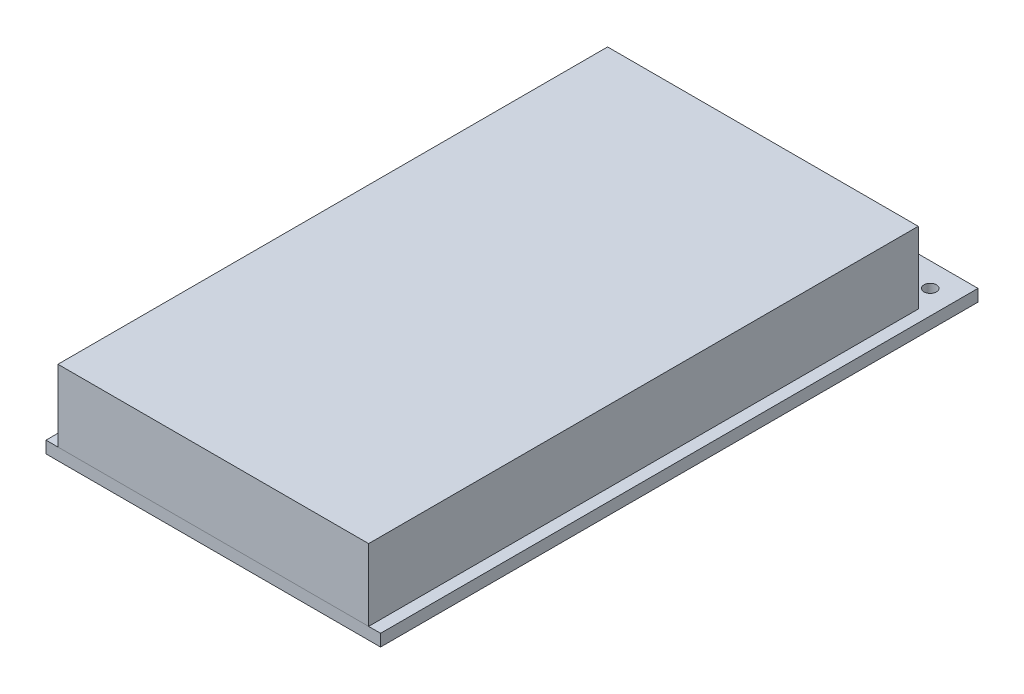
ISO-10303-21;
HEADER;
FILE_DESCRIPTION(('STEP AP214'),'2;1');
FILE_NAME('part.step','',(''),(''),'','','');
FILE_SCHEMA(('AUTOMOTIVE_DESIGN { 1 0 10303 214 1 1 1 1 }'));
ENDSEC;
DATA;
#1=APPLICATION_CONTEXT('core data for automotive mechanical design processes');
#2=APPLICATION_PROTOCOL_DEFINITION('international standard','automotive_design',2000,#1);
#3=PRODUCT_CONTEXT('',#1,'mechanical');
#4=PRODUCT('Part','Part','',(#3));
#5=PRODUCT_RELATED_PRODUCT_CATEGORY('part','',(#4));
#6=PRODUCT_DEFINITION_FORMATION('','',#4);
#7=PRODUCT_DEFINITION_CONTEXT('part definition',#1,'design');
#8=PRODUCT_DEFINITION('design','',#6,#7);
#9=PRODUCT_DEFINITION_SHAPE('','',#8);
#10=(LENGTH_UNIT() NAMED_UNIT(*) SI_UNIT(.MILLI.,.METRE.));
#11=(NAMED_UNIT(*) PLANE_ANGLE_UNIT() SI_UNIT($,.RADIAN.));
#12=(NAMED_UNIT(*) SI_UNIT($,.STERADIAN.) SOLID_ANGLE_UNIT());
#13=UNCERTAINTY_MEASURE_WITH_UNIT(LENGTH_MEASURE(1.E-05),#10,'distance_accuracy_value','');
#14=(GEOMETRIC_REPRESENTATION_CONTEXT(3) GLOBAL_UNCERTAINTY_ASSIGNED_CONTEXT((#13)) GLOBAL_UNIT_ASSIGNED_CONTEXT((#10,
#11,#12)) REPRESENTATION_CONTEXT('',''));
#15=CARTESIAN_POINT('',(0.,0.,0.));
#16=DIRECTION('',(0.,0.,1.));
#17=DIRECTION('',(1.,0.,0.));
#18=AXIS2_PLACEMENT_3D('',#15,#16,#17);
#19=CARTESIAN_POINT('',(-82.55,44.45,158.75));
#20=DIRECTION('',(1.,0.,0.));
#21=DIRECTION('',(0.,0.,-1.));
#22=AXIS2_PLACEMENT_3D('',#19,#20,#21);
#23=PLANE('',#22);
#24=DIRECTION('',(0.,0.,1.));
#25=VECTOR('',#24,1.);
#26=CARTESIAN_POINT('',(-82.55,6.35,158.75));
#27=LINE('',#26,#25);
#28=CARTESIAN_POINT('',(-82.55,6.35,-133.35));
#29=VERTEX_POINT('',#28);
#30=CARTESIAN_POINT('',(-82.55,6.35,158.75));
#31=VERTEX_POINT('',#30);
#32=EDGE_CURVE('E114',#29,#31,#27,.T.);
#33=ORIENTED_EDGE('',*,*,#32,.T.);
#34=DIRECTION('',(0.,-1.,0.));
#35=VECTOR('',#34,1.);
#36=CARTESIAN_POINT('',(-82.55,44.45,158.75));
#37=LINE('',#36,#35);
#38=CARTESIAN_POINT('',(-82.55,44.45,158.75));
#39=VERTEX_POINT('',#38);
#40=EDGE_CURVE('E12',#39,#31,#37,.T.);
#41=ORIENTED_EDGE('',*,*,#40,.F.);
#42=DIRECTION('',(0.,0.,1.));
#43=VECTOR('',#42,1.);
#44=CARTESIAN_POINT('',(-82.55,44.45,158.75));
#45=LINE('',#44,#43);
#46=CARTESIAN_POINT('',(-82.55,44.45,-133.35));
#47=VERTEX_POINT('',#46);
#48=EDGE_CURVE('E102',#47,#39,#45,.T.);
#49=ORIENTED_EDGE('',*,*,#48,.F.);
#50=DIRECTION('',(0.,-1.,0.));
#51=VECTOR('',#50,1.);
#52=CARTESIAN_POINT('',(-82.55,44.45,-133.35));
#53=LINE('',#52,#51);
#54=EDGE_CURVE('E110',#47,#29,#53,.T.);
#55=ORIENTED_EDGE('',*,*,#54,.T.);
#56=EDGE_LOOP('',(#33,#41,#49,#55));
#57=FACE_BOUND('',#56,.T.);
#58=ADVANCED_FACE('F51',(#57),#23,.F.);
#59=CARTESIAN_POINT('',(-82.55,44.45,158.75));
#60=DIRECTION('',(0.,0.,-1.));
#61=DIRECTION('',(-1.,0.,0.));
#62=AXIS2_PLACEMENT_3D('',#59,#60,#61);
#63=PLANE('',#62);
#64=DIRECTION('',(1.,0.,0.));
#65=VECTOR('',#64,1.);
#66=CARTESIAN_POINT('',(-82.55,6.35,158.75));
#67=LINE('',#66,#65);
#68=CARTESIAN_POINT('',(82.55,6.35,158.75));
#69=VERTEX_POINT('',#68);
#70=EDGE_CURVE('E106',#31,#69,#67,.T.);
#71=ORIENTED_EDGE('',*,*,#70,.T.);
#72=DIRECTION('',(0.,-1.,0.));
#73=VECTOR('',#72,1.);
#74=CARTESIAN_POINT('',(82.55,44.45,158.75));
#75=LINE('',#74,#73);
#76=CARTESIAN_POINT('',(82.55,44.45,158.75));
#77=VERTEX_POINT('',#76);
#78=EDGE_CURVE('E59',#77,#69,#75,.T.);
#79=ORIENTED_EDGE('',*,*,#78,.F.);
#80=DIRECTION('',(1.,0.,0.));
#81=VECTOR('',#80,1.);
#82=CARTESIAN_POINT('',(-82.55,44.45,158.75));
#83=LINE('',#82,#81);
#84=EDGE_CURVE('E97',#39,#77,#83,.T.);
#85=ORIENTED_EDGE('',*,*,#84,.F.);
#86=ORIENTED_EDGE('',*,*,#40,.T.);
#87=EDGE_LOOP('',(#71,#79,#85,#86));
#88=FACE_BOUND('',#87,.T.);
#89=ADVANCED_FACE('F105',(#88),#63,.F.);
#90=CARTESIAN_POINT('',(82.55,44.45,158.75));
#91=DIRECTION('',(-1.,0.,0.));
#92=DIRECTION('',(0.,0.,1.));
#93=AXIS2_PLACEMENT_3D('',#90,#91,#92);
#94=PLANE('',#93);
#95=DIRECTION('',(0.,0.,-1.));
#96=VECTOR('',#95,1.);
#97=CARTESIAN_POINT('',(82.55,6.35,158.75));
#98=LINE('',#97,#96);
#99=CARTESIAN_POINT('',(82.55,6.35,-133.35));
#100=VERTEX_POINT('',#99);
#101=EDGE_CURVE('E84',#69,#100,#98,.T.);
#102=ORIENTED_EDGE('',*,*,#101,.T.);
#103=DIRECTION('',(0.,-1.,0.));
#104=VECTOR('',#103,1.);
#105=CARTESIAN_POINT('',(82.55,44.45,-133.35));
#106=LINE('',#105,#104);
#107=CARTESIAN_POINT('',(82.55,44.45,-133.35));
#108=VERTEX_POINT('',#107);
#109=EDGE_CURVE('E107',#108,#100,#106,.T.);
#110=ORIENTED_EDGE('',*,*,#109,.F.);
#111=DIRECTION('',(0.,0.,-1.));
#112=VECTOR('',#111,1.);
#113=CARTESIAN_POINT('',(82.55,44.45,158.75));
#114=LINE('',#113,#112);
#115=EDGE_CURVE('E100',#77,#108,#114,.T.);
#116=ORIENTED_EDGE('',*,*,#115,.F.);
#117=ORIENTED_EDGE('',*,*,#78,.T.);
#118=EDGE_LOOP('',(#102,#110,#116,#117));
#119=FACE_BOUND('',#118,.T.);
#120=ADVANCED_FACE('F108',(#119),#94,.F.);
#121=CARTESIAN_POINT('',(-82.55,44.45,-133.35));
#122=DIRECTION('',(0.,0.,1.));
#123=DIRECTION('',(1.,0.,0.));
#124=AXIS2_PLACEMENT_3D('',#121,#122,#123);
#125=PLANE('',#124);
#126=DIRECTION('',(-1.,0.,0.));
#127=VECTOR('',#126,1.);
#128=CARTESIAN_POINT('',(-82.55,6.35,-133.35));
#129=LINE('',#128,#127);
#130=EDGE_CURVE('E90',#100,#29,#129,.T.);
#131=ORIENTED_EDGE('',*,*,#130,.T.);
#132=ORIENTED_EDGE('',*,*,#54,.F.);
#133=DIRECTION('',(-1.,0.,0.));
#134=VECTOR('',#133,1.);
#135=CARTESIAN_POINT('',(-82.55,44.45,-133.35));
#136=LINE('',#135,#134);
#137=EDGE_CURVE('E67',#108,#47,#136,.T.);
#138=ORIENTED_EDGE('',*,*,#137,.F.);
#139=ORIENTED_EDGE('',*,*,#109,.T.);
#140=EDGE_LOOP('',(#131,#132,#138,#139));
#141=FACE_BOUND('',#140,.T.);
#142=ADVANCED_FACE('F121',(#141),#125,.F.);
#143=CARTESIAN_POINT('',(0.,44.45,0.));
#144=DIRECTION('',(0.,-1.,0.));
#145=DIRECTION('',(0.,0.,-1.));
#146=AXIS2_PLACEMENT_3D('',#143,#144,#145);
#147=PLANE('',#146);
#148=ORIENTED_EDGE('',*,*,#48,.T.);
#149=ORIENTED_EDGE('',*,*,#84,.T.);
#150=ORIENTED_EDGE('',*,*,#115,.T.);
#151=ORIENTED_EDGE('',*,*,#137,.T.);
#152=EDGE_LOOP('',(#148,#149,#150,#151));
#153=FACE_BOUND('',#152,.T.);
#154=ADVANCED_FACE('F98',(#153),#147,.F.);
#155=CARTESIAN_POINT('',(0.,6.35,0.));
#156=DIRECTION('',(0.,-1.,0.));
#157=DIRECTION('',(0.,0.,-1.));
#158=AXIS2_PLACEMENT_3D('',#155,#156,#157);
#159=PLANE('',#158);
#160=ORIENTED_EDGE('',*,*,#32,.F.);
#161=ORIENTED_EDGE('',*,*,#130,.F.);
#162=ORIENTED_EDGE('',*,*,#101,.F.);
#163=ORIENTED_EDGE('',*,*,#70,.F.);
#164=EDGE_LOOP('',(#160,#161,#162,#163));
#165=FACE_BOUND('',#164,.T.);
#166=ADVANCED_FACE('F124',(#165),#159,.T.);
#167=CLOSED_SHELL('',(#58,#89,#120,#142,#154,#166));
#168=MANIFOLD_SOLID_BREP('B2',#167);
#169=CARTESIAN_POINT('',(88.8999999999999,6.35,-158.75));
#170=DIRECTION('',(-1.,0.,0.));
#171=DIRECTION('',(0.,0.,1.));
#172=AXIS2_PLACEMENT_3D('',#169,#170,#171);
#173=PLANE('',#172);
#174=DIRECTION('',(0.,0.,-1.));
#175=VECTOR('',#174,1.);
#176=CARTESIAN_POINT('',(88.8999999999999,0.,-158.75));
#177=LINE('',#176,#175);
#178=CARTESIAN_POINT('',(88.9,0.,158.75));
#179=VERTEX_POINT('',#178);
#180=CARTESIAN_POINT('',(88.8999999999999,0.,-158.75));
#181=VERTEX_POINT('',#180);
#182=EDGE_CURVE('E241',#179,#181,#177,.T.);
#183=ORIENTED_EDGE('',*,*,#182,.T.);
#184=DIRECTION('',(0.,-1.,0.));
#185=VECTOR('',#184,1.);
#186=CARTESIAN_POINT('',(88.8999999999999,6.35,-158.75));
#187=LINE('',#186,#185);
#188=CARTESIAN_POINT('',(88.8999999999999,6.35,-158.75));
#189=VERTEX_POINT('',#188);
#190=EDGE_CURVE('E49',#189,#181,#187,.T.);
#191=ORIENTED_EDGE('',*,*,#190,.F.);
#192=DIRECTION('',(0.,0.,-1.));
#193=VECTOR('',#192,1.);
#194=CARTESIAN_POINT('',(88.8999999999999,6.35,-158.75));
#195=LINE('',#194,#193);
#196=CARTESIAN_POINT('',(88.9,6.35,158.75));
#197=VERTEX_POINT('',#196);
#198=EDGE_CURVE('E228',#197,#189,#195,.T.);
#199=ORIENTED_EDGE('',*,*,#198,.F.);
#200=DIRECTION('',(0.,-1.,0.));
#201=VECTOR('',#200,1.);
#202=CARTESIAN_POINT('',(88.9,6.35,158.75));
#203=LINE('',#202,#201);
#204=EDGE_CURVE('E237',#197,#179,#203,.T.);
#205=ORIENTED_EDGE('',*,*,#204,.T.);
#206=EDGE_LOOP('',(#183,#191,#199,#205));
#207=FACE_BOUND('',#206,.T.);
#208=ADVANCED_FACE('F175',(#207),#173,.F.);
#209=CARTESIAN_POINT('',(-88.9,6.35,-158.75));
#210=DIRECTION('',(0.,0.,1.));
#211=DIRECTION('',(1.,0.,0.));
#212=AXIS2_PLACEMENT_3D('',#209,#210,#211);
#213=PLANE('',#212);
#214=DIRECTION('',(-1.,0.,0.));
#215=VECTOR('',#214,1.);
#216=CARTESIAN_POINT('',(-88.9,0.,-158.75));
#217=LINE('',#216,#215);
#218=CARTESIAN_POINT('',(-88.9,0.,-158.75));
#219=VERTEX_POINT('',#218);
#220=EDGE_CURVE('E232',#181,#219,#217,.T.);
#221=ORIENTED_EDGE('',*,*,#220,.T.);
#222=DIRECTION('',(0.,-1.,0.));
#223=VECTOR('',#222,1.);
#224=CARTESIAN_POINT('',(-88.9,6.35,-158.75));
#225=LINE('',#224,#223);
#226=CARTESIAN_POINT('',(-88.9,6.35,-158.75));
#227=VERTEX_POINT('',#226);
#228=EDGE_CURVE('E184',#227,#219,#225,.T.);
#229=ORIENTED_EDGE('',*,*,#228,.F.);
#230=DIRECTION('',(-1.,0.,0.));
#231=VECTOR('',#230,1.);
#232=CARTESIAN_POINT('',(-88.9,6.35,-158.75));
#233=LINE('',#232,#231);
#234=EDGE_CURVE('E223',#189,#227,#233,.T.);
#235=ORIENTED_EDGE('',*,*,#234,.F.);
#236=ORIENTED_EDGE('',*,*,#190,.T.);
#237=EDGE_LOOP('',(#221,#229,#235,#236));
#238=FACE_BOUND('',#237,.T.);
#239=ADVANCED_FACE('F231',(#238),#213,.F.);
#240=CARTESIAN_POINT('',(-88.9,6.35,-158.75));
#241=DIRECTION('',(1.,0.,0.));
#242=DIRECTION('',(0.,0.,-1.));
#243=AXIS2_PLACEMENT_3D('',#240,#241,#242);
#244=PLANE('',#243);
#245=DIRECTION('',(0.,0.,1.));
#246=VECTOR('',#245,1.);
#247=CARTESIAN_POINT('',(-88.9,0.,-158.75));
#248=LINE('',#247,#246);
#249=CARTESIAN_POINT('',(-88.9,0.,158.75));
#250=VERTEX_POINT('',#249);
#251=EDGE_CURVE('E210',#219,#250,#248,.T.);
#252=ORIENTED_EDGE('',*,*,#251,.T.);
#253=DIRECTION('',(0.,-1.,0.));
#254=VECTOR('',#253,1.);
#255=CARTESIAN_POINT('',(-88.9,6.35,158.75));
#256=LINE('',#255,#254);
#257=CARTESIAN_POINT('',(-88.9,6.35,158.75));
#258=VERTEX_POINT('',#257);
#259=EDGE_CURVE('E233',#258,#250,#256,.T.);
#260=ORIENTED_EDGE('',*,*,#259,.F.);
#261=DIRECTION('',(0.,0.,1.));
#262=VECTOR('',#261,1.);
#263=CARTESIAN_POINT('',(-88.9,6.35,-158.75));
#264=LINE('',#263,#262);
#265=EDGE_CURVE('E226',#227,#258,#264,.T.);
#266=ORIENTED_EDGE('',*,*,#265,.F.);
#267=ORIENTED_EDGE('',*,*,#228,.T.);
#268=EDGE_LOOP('',(#252,#260,#266,#267));
#269=FACE_BOUND('',#268,.T.);
#270=ADVANCED_FACE('F235',(#269),#244,.F.);
#271=CARTESIAN_POINT('',(-88.9,6.35,158.75));
#272=DIRECTION('',(0.,0.,-1.));
#273=DIRECTION('',(-1.,0.,0.));
#274=AXIS2_PLACEMENT_3D('',#271,#272,#273);
#275=PLANE('',#274);
#276=DIRECTION('',(1.,0.,0.));
#277=VECTOR('',#276,1.);
#278=CARTESIAN_POINT('',(-88.9,0.,158.75));
#279=LINE('',#278,#277);
#280=EDGE_CURVE('E216',#250,#179,#279,.T.);
#281=ORIENTED_EDGE('',*,*,#280,.T.);
#282=ORIENTED_EDGE('',*,*,#204,.F.);
#283=DIRECTION('',(1.,0.,0.));
#284=VECTOR('',#283,1.);
#285=CARTESIAN_POINT('',(-88.9,6.35,158.75));
#286=LINE('',#285,#284);
#287=EDGE_CURVE('E193',#258,#197,#286,.T.);
#288=ORIENTED_EDGE('',*,*,#287,.F.);
#289=ORIENTED_EDGE('',*,*,#259,.T.);
#290=EDGE_LOOP('',(#281,#282,#288,#289));
#291=FACE_BOUND('',#290,.T.);
#292=ADVANCED_FACE('F269',(#291),#275,.F.);
#293=CARTESIAN_POINT('',(0.,6.35,0.));
#294=DIRECTION('',(0.,1.,0.));
#295=DIRECTION('',(0.,0.,1.));
#296=AXIS2_PLACEMENT_3D('',#293,#294,#295);
#297=PLANE('',#296);
#298=CARTESIAN_POINT('',(76.2,6.35,-146.05));
#299=DIRECTION('',(0.,1.,0.));
#300=DIRECTION('',(0.,0.,1.));
#301=AXIS2_PLACEMENT_3D('',#298,#299,#300);
#302=CIRCLE('',#301,3.302);
#303=CARTESIAN_POINT('',(76.2,6.35,-142.748));
#304=VERTEX_POINT('',#303);
#305=EDGE_CURVE('E244',#304,#304,#302,.T.);
#306=ORIENTED_EDGE('',*,*,#305,.F.);
#307=EDGE_LOOP('',(#306));
#308=FACE_BOUND('',#307,.T.);
#309=CARTESIAN_POINT('',(-76.1999999999999,6.35,-146.05));
#310=DIRECTION('',(0.,1.,0.));
#311=DIRECTION('',(0.,0.,1.));
#312=AXIS2_PLACEMENT_3D('',#309,#310,#311);
#313=CIRCLE('',#312,3.302);
#314=CARTESIAN_POINT('',(-76.1999999999999,6.35,-142.748));
#315=VERTEX_POINT('',#314);
#316=EDGE_CURVE('E251',#315,#315,#313,.T.);
#317=ORIENTED_EDGE('',*,*,#316,.F.);
#318=EDGE_LOOP('',(#317));
#319=FACE_BOUND('',#318,.T.);
#320=ORIENTED_EDGE('',*,*,#198,.T.);
#321=ORIENTED_EDGE('',*,*,#234,.T.);
#322=ORIENTED_EDGE('',*,*,#265,.T.);
#323=ORIENTED_EDGE('',*,*,#287,.T.);
#324=EDGE_LOOP('',(#320,#321,#322,#323));
#325=FACE_BOUND('',#324,.T.);
#326=ADVANCED_FACE('F224',(#308,#319,#325),#297,.T.);
#327=CARTESIAN_POINT('',(0.,0.,0.));
#328=DIRECTION('',(0.,1.,0.));
#329=DIRECTION('',(0.,0.,1.));
#330=AXIS2_PLACEMENT_3D('',#327,#328,#329);
#331=PLANE('',#330);
#332=CARTESIAN_POINT('',(76.2,0.,-146.05));
#333=DIRECTION('',(0.,1.,0.));
#334=DIRECTION('',(0.,0.,1.));
#335=AXIS2_PLACEMENT_3D('',#332,#333,#334);
#336=CIRCLE('',#335,3.302);
#337=CARTESIAN_POINT('',(76.2,0.,-142.748));
#338=VERTEX_POINT('',#337);
#339=EDGE_CURVE('E178',#338,#338,#336,.T.);
#340=ORIENTED_EDGE('',*,*,#339,.T.);
#341=EDGE_LOOP('',(#340));
#342=FACE_BOUND('',#341,.T.);
#343=CARTESIAN_POINT('',(-76.1999999999999,0.,-146.05));
#344=DIRECTION('',(0.,1.,0.));
#345=DIRECTION('',(0.,0.,1.));
#346=AXIS2_PLACEMENT_3D('',#343,#344,#345);
#347=CIRCLE('',#346,3.302);
#348=CARTESIAN_POINT('',(-76.1999999999999,0.,-142.748));
#349=VERTEX_POINT('',#348);
#350=EDGE_CURVE('E249',#349,#349,#347,.T.);
#351=ORIENTED_EDGE('',*,*,#350,.T.);
#352=EDGE_LOOP('',(#351));
#353=FACE_BOUND('',#352,.T.);
#354=ORIENTED_EDGE('',*,*,#182,.F.);
#355=ORIENTED_EDGE('',*,*,#280,.F.);
#356=ORIENTED_EDGE('',*,*,#251,.F.);
#357=ORIENTED_EDGE('',*,*,#220,.F.);
#358=EDGE_LOOP('',(#354,#355,#356,#357));
#359=FACE_BOUND('',#358,.T.);
#360=ADVANCED_FACE('F268',(#342,#353,#359),#331,.F.);
#361=CARTESIAN_POINT('',(-76.1999999999999,44.45,-146.05));
#362=DIRECTION('',(0.,-1.,0.));
#363=DIRECTION('',(0.,0.,-1.));
#364=AXIS2_PLACEMENT_3D('',#361,#362,#363);
#365=CYLINDRICAL_SURFACE('',#364,3.302);
#366=ORIENTED_EDGE('',*,*,#316,.T.);
#367=EDGE_LOOP('',(#366));
#368=FACE_BOUND('',#367,.T.);
#369=ORIENTED_EDGE('',*,*,#350,.F.);
#370=EDGE_LOOP('',(#369));
#371=FACE_BOUND('',#370,.T.);
#372=ADVANCED_FACE('F275',(#368,#371),#365,.F.);
#373=CARTESIAN_POINT('',(76.2,44.45,-146.05));
#374=DIRECTION('',(0.,-1.,0.));
#375=DIRECTION('',(0.,0.,-1.));
#376=AXIS2_PLACEMENT_3D('',#373,#374,#375);
#377=CYLINDRICAL_SURFACE('',#376,3.302);
#378=ORIENTED_EDGE('',*,*,#305,.T.);
#379=EDGE_LOOP('',(#378));
#380=FACE_BOUND('',#379,.T.);
#381=ORIENTED_EDGE('',*,*,#339,.F.);
#382=EDGE_LOOP('',(#381));
#383=FACE_BOUND('',#382,.T.);
#384=ADVANCED_FACE('F263',(#380,#383),#377,.F.);
#385=CLOSED_SHELL('',(#208,#239,#270,#292,#326,#360,#372,#384));
#386=MANIFOLD_SOLID_BREP('B6',#385);
#387=ADVANCED_BREP_SHAPE_REPRESENTATION('',(#18,#168,#386),#14);
#388=SHAPE_DEFINITION_REPRESENTATION(#9,#387);
ENDSEC;
END-ISO-10303-21;
